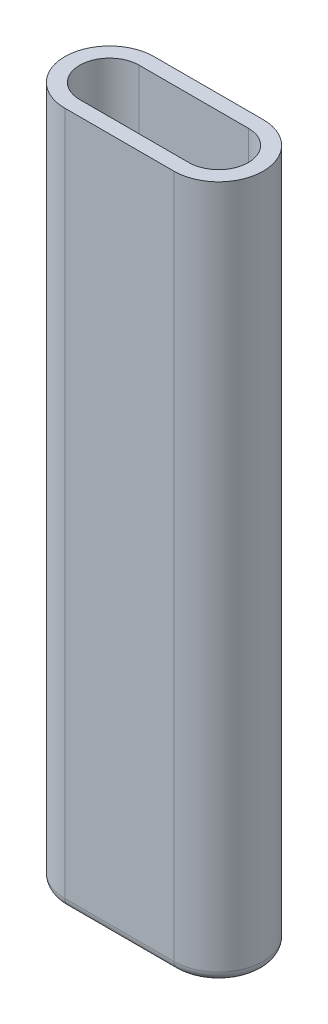
ISO-10303-21;
HEADER;
FILE_DESCRIPTION(('STEP AP214'),'2;1');
FILE_NAME('part.step','',(''),(''),'','','');
FILE_SCHEMA(('AUTOMOTIVE_DESIGN { 1 0 10303 214 1 1 1 1 }'));
ENDSEC;
DATA;
#1=APPLICATION_CONTEXT('core data for automotive mechanical design processes');
#2=APPLICATION_PROTOCOL_DEFINITION('international standard','automotive_design',2000,#1);
#3=PRODUCT_CONTEXT('',#1,'mechanical');
#4=PRODUCT('Part','Part','',(#3));
#5=PRODUCT_RELATED_PRODUCT_CATEGORY('part','',(#4));
#6=PRODUCT_DEFINITION_FORMATION('','',#4);
#7=PRODUCT_DEFINITION_CONTEXT('part definition',#1,'design');
#8=PRODUCT_DEFINITION('design','',#6,#7);
#9=PRODUCT_DEFINITION_SHAPE('','',#8);
#10=(LENGTH_UNIT() NAMED_UNIT(*) SI_UNIT(.MILLI.,.METRE.));
#11=(NAMED_UNIT(*) PLANE_ANGLE_UNIT() SI_UNIT($,.RADIAN.));
#12=(NAMED_UNIT(*) SI_UNIT($,.STERADIAN.) SOLID_ANGLE_UNIT());
#13=UNCERTAINTY_MEASURE_WITH_UNIT(LENGTH_MEASURE(1.E-05),#10,'distance_accuracy_value','');
#14=(GEOMETRIC_REPRESENTATION_CONTEXT(3) GLOBAL_UNCERTAINTY_ASSIGNED_CONTEXT((#13)) GLOBAL_UNIT_ASSIGNED_CONTEXT((#10,
#11,#12)) REPRESENTATION_CONTEXT('',''));
#15=CARTESIAN_POINT('',(0.,0.,0.));
#16=DIRECTION('',(0.,0.,1.));
#17=DIRECTION('',(1.,0.,0.));
#18=AXIS2_PLACEMENT_3D('',#15,#16,#17);
#19=CARTESIAN_POINT('',(-5.5,70.,3.));
#20=DIRECTION('',(0.,0.,-1.));
#21=DIRECTION('',(-1.,0.,0.));
#22=AXIS2_PLACEMENT_3D('',#19,#20,#21);
#23=PLANE('',#22);
#24=DIRECTION('',(1.,0.,0.));
#25=VECTOR('',#24,1.);
#26=CARTESIAN_POINT('',(-5.5,1.5,3.));
#27=LINE('',#26,#25);
#28=CARTESIAN_POINT('',(1.,1.5,3.));
#29=VERTEX_POINT('',#28);
#30=CARTESIAN_POINT('',(5.5,1.5,3.));
#31=VERTEX_POINT('',#30);
#32=EDGE_CURVE('E452',#29,#31,#27,.T.);
#33=ORIENTED_EDGE('',*,*,#32,.F.);
#34=DIRECTION('',(0.,-1.,0.));
#35=VECTOR('',#34,1.);
#36=CARTESIAN_POINT('',(1.,51.5,3.));
#37=LINE('',#36,#35);
#38=CARTESIAN_POINT('',(1.,50.5,3.));
#39=VERTEX_POINT('',#38);
#40=EDGE_CURVE('E153',#39,#29,#37,.T.);
#41=ORIENTED_EDGE('',*,*,#40,.F.);
#42=CARTESIAN_POINT('',(0.,50.5,3.));
#43=DIRECTION('',(0.,0.,-1.));
#44=DIRECTION('',(-1.,0.,0.));
#45=AXIS2_PLACEMENT_3D('',#42,#43,#44);
#46=CIRCLE('',#45,1.);
#47=CARTESIAN_POINT('',(0.,51.5,3.));
#48=VERTEX_POINT('',#47);
#49=EDGE_CURVE('E11',#39,#48,#46,.F.);
#50=ORIENTED_EDGE('',*,*,#49,.T.);
#51=CARTESIAN_POINT('',(0.,50.5,3.));
#52=DIRECTION('',(0.,0.,-1.));
#53=DIRECTION('',(-1.,0.,0.));
#54=AXIS2_PLACEMENT_3D('',#51,#52,#53);
#55=CIRCLE('',#54,1.);
#56=CARTESIAN_POINT('',(-1.,50.5,3.));
#57=VERTEX_POINT('',#56);
#58=EDGE_CURVE('E224',#48,#57,#55,.F.);
#59=ORIENTED_EDGE('',*,*,#58,.T.);
#60=DIRECTION('',(0.,-1.,0.));
#61=VECTOR('',#60,1.);
#62=CARTESIAN_POINT('',(-1.,51.5,3.));
#63=LINE('',#62,#61);
#64=CARTESIAN_POINT('',(-1.,1.5,3.));
#65=VERTEX_POINT('',#64);
#66=EDGE_CURVE('E467',#57,#65,#63,.T.);
#67=ORIENTED_EDGE('',*,*,#66,.T.);
#68=CARTESIAN_POINT('',(-5.5,1.5,3.));
#69=VERTEX_POINT('',#68);
#70=EDGE_CURVE('E446',#69,#65,#27,.T.);
#71=ORIENTED_EDGE('',*,*,#70,.F.);
#72=DIRECTION('',(0.,1.,0.));
#73=VECTOR('',#72,1.);
#74=CARTESIAN_POINT('',(-5.5,70.,3.));
#75=LINE('',#74,#73);
#76=CARTESIAN_POINT('',(-5.5,70.,3.));
#77=VERTEX_POINT('',#76);
#78=EDGE_CURVE('E183',#77,#69,#75,.F.);
#79=ORIENTED_EDGE('',*,*,#78,.F.);
#80=DIRECTION('',(1.,0.,0.));
#81=VECTOR('',#80,1.);
#82=CARTESIAN_POINT('',(-5.5,70.,3.));
#83=LINE('',#82,#81);
#84=CARTESIAN_POINT('',(5.5,70.,3.));
#85=VERTEX_POINT('',#84);
#86=EDGE_CURVE('E166',#77,#85,#83,.T.);
#87=ORIENTED_EDGE('',*,*,#86,.T.);
#88=DIRECTION('',(0.,-1.,0.));
#89=VECTOR('',#88,1.);
#90=CARTESIAN_POINT('',(5.5,70.,3.));
#91=LINE('',#90,#89);
#92=EDGE_CURVE('E457',#85,#31,#91,.T.);
#93=ORIENTED_EDGE('',*,*,#92,.T.);
#94=EDGE_LOOP('',(#33,#41,#50,#59,#67,#71,#79,#87,#93));
#95=FACE_BOUND('',#94,.T.);
#96=ADVANCED_FACE('F33',(#95),#23,.T.);
#97=CARTESIAN_POINT('',(-5.5,70.,-3.));
#98=DIRECTION('',(0.,0.,1.));
#99=DIRECTION('',(1.,0.,0.));
#100=AXIS2_PLACEMENT_3D('',#97,#98,#99);
#101=PLANE('',#100);
#102=CARTESIAN_POINT('',(0.,50.5,-3.));
#103=DIRECTION('',(0.,0.,1.));
#104=DIRECTION('',(1.,0.,0.));
#105=AXIS2_PLACEMENT_3D('',#102,#103,#104);
#106=CIRCLE('',#105,1.);
#107=CARTESIAN_POINT('',(-1.,50.5,-3.));
#108=VERTEX_POINT('',#107);
#109=CARTESIAN_POINT('',(0.,51.5,-3.));
#110=VERTEX_POINT('',#109);
#111=EDGE_CURVE('E50',#108,#110,#106,.F.);
#112=ORIENTED_EDGE('',*,*,#111,.T.);
#113=CARTESIAN_POINT('',(0.,50.5,-3.));
#114=DIRECTION('',(0.,0.,1.));
#115=DIRECTION('',(1.,0.,0.));
#116=AXIS2_PLACEMENT_3D('',#113,#114,#115);
#117=CIRCLE('',#116,1.);
#118=CARTESIAN_POINT('',(1.,50.5,-3.));
#119=VERTEX_POINT('',#118);
#120=EDGE_CURVE('E42',#110,#119,#117,.F.);
#121=ORIENTED_EDGE('',*,*,#120,.T.);
#122=DIRECTION('',(0.,-1.,0.));
#123=VECTOR('',#122,1.);
#124=CARTESIAN_POINT('',(1.,51.5,-3.));
#125=LINE('',#124,#123);
#126=CARTESIAN_POINT('',(1.,1.5,-3.));
#127=VERTEX_POINT('',#126);
#128=EDGE_CURVE('E140',#119,#127,#125,.T.);
#129=ORIENTED_EDGE('',*,*,#128,.T.);
#130=DIRECTION('',(-1.,0.,0.));
#131=VECTOR('',#130,1.);
#132=CARTESIAN_POINT('',(-5.5,1.5,-3.));
#133=LINE('',#132,#131);
#134=CARTESIAN_POINT('',(5.5,1.5,-3.));
#135=VERTEX_POINT('',#134);
#136=EDGE_CURVE('E144',#135,#127,#133,.T.);
#137=ORIENTED_EDGE('',*,*,#136,.F.);
#138=DIRECTION('',(0.,1.,0.));
#139=VECTOR('',#138,1.);
#140=CARTESIAN_POINT('',(5.5,70.,-3.));
#141=LINE('',#140,#139);
#142=CARTESIAN_POINT('',(5.5,70.,-3.));
#143=VERTEX_POINT('',#142);
#144=EDGE_CURVE('E169',#143,#135,#141,.F.);
#145=ORIENTED_EDGE('',*,*,#144,.F.);
#146=DIRECTION('',(-1.,0.,0.));
#147=VECTOR('',#146,1.);
#148=CARTESIAN_POINT('',(-5.5,70.,-3.));
#149=LINE('',#148,#147);
#150=CARTESIAN_POINT('',(-5.5,70.,-3.));
#151=VERTEX_POINT('',#150);
#152=EDGE_CURVE('E176',#143,#151,#149,.T.);
#153=ORIENTED_EDGE('',*,*,#152,.T.);
#154=DIRECTION('',(0.,-1.,0.));
#155=VECTOR('',#154,1.);
#156=CARTESIAN_POINT('',(-5.5,70.,-3.));
#157=LINE('',#156,#155);
#158=CARTESIAN_POINT('',(-5.5,1.5,-3.));
#159=VERTEX_POINT('',#158);
#160=EDGE_CURVE('E178',#151,#159,#157,.T.);
#161=ORIENTED_EDGE('',*,*,#160,.T.);
#162=CARTESIAN_POINT('',(-1.,1.5,-3.));
#163=VERTEX_POINT('',#162);
#164=EDGE_CURVE('E164',#163,#159,#133,.T.);
#165=ORIENTED_EDGE('',*,*,#164,.F.);
#166=DIRECTION('',(0.,-1.,0.));
#167=VECTOR('',#166,1.);
#168=CARTESIAN_POINT('',(-1.,51.5,-3.));
#169=LINE('',#168,#167);
#170=EDGE_CURVE('E148',#108,#163,#169,.T.);
#171=ORIENTED_EDGE('',*,*,#170,.F.);
#172=EDGE_LOOP('',(#112,#121,#129,#137,#145,#153,#161,#165,#171));
#173=FACE_BOUND('',#172,.T.);
#174=ADVANCED_FACE('F142',(#173),#101,.T.);
#175=CARTESIAN_POINT('',(-5.5,1.5,0.));
#176=DIRECTION('',(0.,1.,0.));
#177=DIRECTION('',(0.,0.,1.));
#178=AXIS2_PLACEMENT_3D('',#175,#176,#177);
#179=PLANE('',#178);
#180=ORIENTED_EDGE('',*,*,#136,.T.);
#181=DIRECTION('',(0.,0.,-1.));
#182=VECTOR('',#181,1.);
#183=CARTESIAN_POINT('',(1.,1.5,3.));
#184=LINE('',#183,#182);
#185=EDGE_CURVE('E151',#29,#127,#184,.T.);
#186=ORIENTED_EDGE('',*,*,#185,.F.);
#187=ORIENTED_EDGE('',*,*,#32,.T.);
#188=CARTESIAN_POINT('',(5.5,1.5,0.));
#189=DIRECTION('',(0.,1.,0.));
#190=DIRECTION('',(0.,0.,1.));
#191=AXIS2_PLACEMENT_3D('',#188,#189,#190);
#192=CIRCLE('',#191,3.);
#193=EDGE_CURVE('E161',#31,#135,#192,.T.);
#194=ORIENTED_EDGE('',*,*,#193,.T.);
#195=EDGE_LOOP('',(#180,#186,#187,#194));
#196=FACE_BOUND('',#195,.T.);
#197=ADVANCED_FACE('F159',(#196),#179,.T.);
#198=ORIENTED_EDGE('',*,*,#70,.T.);
#199=DIRECTION('',(0.,0.,1.));
#200=VECTOR('',#199,1.);
#201=CARTESIAN_POINT('',(-1.,1.5,3.));
#202=LINE('',#201,#200);
#203=EDGE_CURVE('E156',#163,#65,#202,.T.);
#204=ORIENTED_EDGE('',*,*,#203,.F.);
#205=ORIENTED_EDGE('',*,*,#164,.T.);
#206=CARTESIAN_POINT('',(-5.5,1.5,0.));
#207=DIRECTION('',(0.,1.,0.));
#208=DIRECTION('',(0.,0.,1.));
#209=AXIS2_PLACEMENT_3D('',#206,#207,#208);
#210=CIRCLE('',#209,3.);
#211=EDGE_CURVE('E147',#159,#69,#210,.T.);
#212=ORIENTED_EDGE('',*,*,#211,.T.);
#213=EDGE_LOOP('',(#198,#204,#205,#212));
#214=FACE_BOUND('',#213,.T.);
#215=ADVANCED_FACE('F281',(#214),#179,.T.);
#216=CARTESIAN_POINT('',(-5.5,70.,0.));
#217=DIRECTION('',(0.,-1.,0.));
#218=DIRECTION('',(0.,0.,-1.));
#219=AXIS2_PLACEMENT_3D('',#216,#217,#218);
#220=CYLINDRICAL_SURFACE('',#219,4.5);
#221=DIRECTION('',(0.,-1.,0.));
#222=VECTOR('',#221,1.);
#223=CARTESIAN_POINT('',(-5.5,70.,-4.5));
#224=LINE('',#223,#222);
#225=CARTESIAN_POINT('',(-5.5,70.,-4.5));
#226=VERTEX_POINT('',#225);
#227=CARTESIAN_POINT('',(-5.5,1.,-4.5));
#228=VERTEX_POINT('',#227);
#229=EDGE_CURVE('E189',#226,#228,#224,.T.);
#230=ORIENTED_EDGE('',*,*,#229,.T.);
#231=CARTESIAN_POINT('',(-5.5,1.,0.));
#232=DIRECTION('',(0.,1.,0.));
#233=DIRECTION('',(0.,0.,1.));
#234=AXIS2_PLACEMENT_3D('',#231,#232,#233);
#235=CIRCLE('',#234,4.5);
#236=CARTESIAN_POINT('',(-5.5,1.,4.5));
#237=VERTEX_POINT('',#236);
#238=EDGE_CURVE('E217',#228,#237,#235,.T.);
#239=ORIENTED_EDGE('',*,*,#238,.T.);
#240=DIRECTION('',(0.,-1.,0.));
#241=VECTOR('',#240,1.);
#242=CARTESIAN_POINT('',(-5.5,70.,4.5));
#243=LINE('',#242,#241);
#244=CARTESIAN_POINT('',(-5.5,70.,4.5));
#245=VERTEX_POINT('',#244);
#246=EDGE_CURVE('E198',#245,#237,#243,.T.);
#247=ORIENTED_EDGE('',*,*,#246,.F.);
#248=CARTESIAN_POINT('',(-5.5,70.,0.));
#249=DIRECTION('',(0.,1.,0.));
#250=DIRECTION('',(0.,0.,1.));
#251=AXIS2_PLACEMENT_3D('',#248,#249,#250);
#252=CIRCLE('',#251,4.5);
#253=EDGE_CURVE('E179',#226,#245,#252,.T.);
#254=ORIENTED_EDGE('',*,*,#253,.F.);
#255=EDGE_LOOP('',(#230,#239,#247,#254));
#256=FACE_BOUND('',#255,.T.);
#257=ADVANCED_FACE('F265',(#256),#220,.T.);
#258=CARTESIAN_POINT('',(-5.5,70.,4.5));
#259=DIRECTION('',(0.,0.,-1.));
#260=DIRECTION('',(-1.,0.,0.));
#261=AXIS2_PLACEMENT_3D('',#258,#259,#260);
#262=PLANE('',#261);
#263=ORIENTED_EDGE('',*,*,#246,.T.);
#264=DIRECTION('',(1.,0.,0.));
#265=VECTOR('',#264,1.);
#266=CARTESIAN_POINT('',(-5.5,1.,4.5));
#267=LINE('',#266,#265);
#268=CARTESIAN_POINT('',(5.5,1.,4.5));
#269=VERTEX_POINT('',#268);
#270=EDGE_CURVE('E215',#237,#269,#267,.T.);
#271=ORIENTED_EDGE('',*,*,#270,.T.);
#272=DIRECTION('',(0.,-1.,0.));
#273=VECTOR('',#272,1.);
#274=CARTESIAN_POINT('',(5.5,70.,4.5));
#275=LINE('',#274,#273);
#276=CARTESIAN_POINT('',(5.5,70.,4.5));
#277=VERTEX_POINT('',#276);
#278=EDGE_CURVE('E195',#277,#269,#275,.T.);
#279=ORIENTED_EDGE('',*,*,#278,.F.);
#280=DIRECTION('',(1.,0.,0.));
#281=VECTOR('',#280,1.);
#282=CARTESIAN_POINT('',(-5.5,70.,4.5));
#283=LINE('',#282,#281);
#284=EDGE_CURVE('E182',#245,#277,#283,.T.);
#285=ORIENTED_EDGE('',*,*,#284,.F.);
#286=EDGE_LOOP('',(#263,#271,#279,#285));
#287=FACE_BOUND('',#286,.T.);
#288=ADVANCED_FACE('F273',(#287),#262,.F.);
#289=CARTESIAN_POINT('',(5.5,70.,0.));
#290=DIRECTION('',(0.,-1.,0.));
#291=DIRECTION('',(0.,0.,-1.));
#292=AXIS2_PLACEMENT_3D('',#289,#290,#291);
#293=CYLINDRICAL_SURFACE('',#292,4.5);
#294=ORIENTED_EDGE('',*,*,#278,.T.);
#295=CARTESIAN_POINT('',(5.5,1.,0.));
#296=DIRECTION('',(0.,1.,0.));
#297=DIRECTION('',(0.,0.,1.));
#298=AXIS2_PLACEMENT_3D('',#295,#296,#297);
#299=CIRCLE('',#298,4.5);
#300=CARTESIAN_POINT('',(5.5,1.,-4.5));
#301=VERTEX_POINT('',#300);
#302=EDGE_CURVE('E213',#269,#301,#299,.T.);
#303=ORIENTED_EDGE('',*,*,#302,.T.);
#304=DIRECTION('',(0.,-1.,0.));
#305=VECTOR('',#304,1.);
#306=CARTESIAN_POINT('',(5.5,70.,-4.5));
#307=LINE('',#306,#305);
#308=CARTESIAN_POINT('',(5.5,70.,-4.5));
#309=VERTEX_POINT('',#308);
#310=EDGE_CURVE('E192',#309,#301,#307,.T.);
#311=ORIENTED_EDGE('',*,*,#310,.F.);
#312=CARTESIAN_POINT('',(5.5,70.,0.));
#313=DIRECTION('',(0.,1.,0.));
#314=DIRECTION('',(0.,0.,1.));
#315=AXIS2_PLACEMENT_3D('',#312,#313,#314);
#316=CIRCLE('',#315,4.5);
#317=EDGE_CURVE('E185',#277,#309,#316,.T.);
#318=ORIENTED_EDGE('',*,*,#317,.F.);
#319=EDGE_LOOP('',(#294,#303,#311,#318));
#320=FACE_BOUND('',#319,.T.);
#321=ADVANCED_FACE('F271',(#320),#293,.T.);
#322=CARTESIAN_POINT('',(-5.5,70.,-4.5));
#323=DIRECTION('',(0.,0.,1.));
#324=DIRECTION('',(1.,0.,0.));
#325=AXIS2_PLACEMENT_3D('',#322,#323,#324);
#326=PLANE('',#325);
#327=ORIENTED_EDGE('',*,*,#310,.T.);
#328=DIRECTION('',(-1.,0.,0.));
#329=VECTOR('',#328,1.);
#330=CARTESIAN_POINT('',(-5.5,1.,-4.5));
#331=LINE('',#330,#329);
#332=EDGE_CURVE('E201',#301,#228,#331,.T.);
#333=ORIENTED_EDGE('',*,*,#332,.T.);
#334=ORIENTED_EDGE('',*,*,#229,.F.);
#335=DIRECTION('',(-1.,0.,0.));
#336=VECTOR('',#335,1.);
#337=CARTESIAN_POINT('',(-5.5,70.,-4.5));
#338=LINE('',#337,#336);
#339=EDGE_CURVE('E187',#309,#226,#338,.T.);
#340=ORIENTED_EDGE('',*,*,#339,.F.);
#341=EDGE_LOOP('',(#327,#333,#334,#340));
#342=FACE_BOUND('',#341,.T.);
#343=ADVANCED_FACE('F261',(#342),#326,.F.);
#344=CARTESIAN_POINT('',(-5.5,70.,0.));
#345=DIRECTION('',(0.,1.,0.));
#346=DIRECTION('',(0.,0.,1.));
#347=AXIS2_PLACEMENT_3D('',#344,#345,#346);
#348=PLANE('',#347);
#349=CARTESIAN_POINT('',(-5.5,70.,0.));
#350=DIRECTION('',(0.,1.,0.));
#351=DIRECTION('',(0.,0.,1.));
#352=AXIS2_PLACEMENT_3D('',#349,#350,#351);
#353=CIRCLE('',#352,3.);
#354=EDGE_CURVE('E163',#151,#77,#353,.T.);
#355=ORIENTED_EDGE('',*,*,#354,.F.);
#356=ORIENTED_EDGE('',*,*,#152,.F.);
#357=CARTESIAN_POINT('',(5.5,70.,0.));
#358=DIRECTION('',(0.,1.,0.));
#359=DIRECTION('',(0.,0.,1.));
#360=AXIS2_PLACEMENT_3D('',#357,#358,#359);
#361=CIRCLE('',#360,3.);
#362=EDGE_CURVE('E173',#85,#143,#361,.T.);
#363=ORIENTED_EDGE('',*,*,#362,.F.);
#364=ORIENTED_EDGE('',*,*,#86,.F.);
#365=EDGE_LOOP('',(#355,#356,#363,#364));
#366=FACE_BOUND('',#365,.T.);
#367=ORIENTED_EDGE('',*,*,#253,.T.);
#368=ORIENTED_EDGE('',*,*,#284,.T.);
#369=ORIENTED_EDGE('',*,*,#317,.T.);
#370=ORIENTED_EDGE('',*,*,#339,.T.);
#371=EDGE_LOOP('',(#367,#368,#369,#370));
#372=FACE_BOUND('',#371,.T.);
#373=ADVANCED_FACE('F267',(#366,#372),#348,.T.);
#374=CARTESIAN_POINT('',(-5.5,0.,0.));
#375=DIRECTION('',(0.,1.,0.));
#376=DIRECTION('',(0.,0.,1.));
#377=AXIS2_PLACEMENT_3D('',#374,#375,#376);
#378=PLANE('',#377);
#379=CARTESIAN_POINT('',(-5.5,0.,0.));
#380=DIRECTION('',(0.,1.,0.));
#381=DIRECTION('',(0.,0.,1.));
#382=AXIS2_PLACEMENT_3D('',#379,#380,#381);
#383=CIRCLE('',#382,3.5);
#384=CARTESIAN_POINT('',(-5.5,0.,3.5));
#385=VERTEX_POINT('',#384);
#386=CARTESIAN_POINT('',(-5.5,0.,-3.5));
#387=VERTEX_POINT('',#386);
#388=EDGE_CURVE('E204',#385,#387,#383,.F.);
#389=ORIENTED_EDGE('',*,*,#388,.T.);
#390=DIRECTION('',(-1.,0.,0.));
#391=VECTOR('',#390,1.);
#392=CARTESIAN_POINT('',(-5.5,0.,-3.5));
#393=LINE('',#392,#391);
#394=CARTESIAN_POINT('',(5.5,0.,-3.5));
#395=VERTEX_POINT('',#394);
#396=EDGE_CURVE('E210',#387,#395,#393,.F.);
#397=ORIENTED_EDGE('',*,*,#396,.T.);
#398=CARTESIAN_POINT('',(5.5,0.,0.));
#399=DIRECTION('',(0.,1.,0.));
#400=DIRECTION('',(0.,0.,1.));
#401=AXIS2_PLACEMENT_3D('',#398,#399,#400);
#402=CIRCLE('',#401,3.5);
#403=CARTESIAN_POINT('',(5.5,0.,3.5));
#404=VERTEX_POINT('',#403);
#405=EDGE_CURVE('E208',#395,#404,#402,.F.);
#406=ORIENTED_EDGE('',*,*,#405,.T.);
#407=DIRECTION('',(1.,0.,0.));
#408=VECTOR('',#407,1.);
#409=CARTESIAN_POINT('',(-5.5,0.,3.5));
#410=LINE('',#409,#408);
#411=EDGE_CURVE('E206',#404,#385,#410,.F.);
#412=ORIENTED_EDGE('',*,*,#411,.T.);
#413=EDGE_LOOP('',(#389,#397,#406,#412));
#414=FACE_BOUND('',#413,.T.);
#415=ADVANCED_FACE('F248',(#414),#378,.F.);
#416=CARTESIAN_POINT('',(-5.5,70.,0.));
#417=DIRECTION('',(0.,-1.,0.));
#418=DIRECTION('',(0.,0.,-1.));
#419=AXIS2_PLACEMENT_3D('',#416,#417,#418);
#420=CYLINDRICAL_SURFACE('',#419,3.);
#421=ORIENTED_EDGE('',*,*,#211,.F.);
#422=ORIENTED_EDGE('',*,*,#160,.F.);
#423=ORIENTED_EDGE('',*,*,#354,.T.);
#424=ORIENTED_EDGE('',*,*,#78,.T.);
#425=EDGE_LOOP('',(#421,#422,#423,#424));
#426=FACE_BOUND('',#425,.T.);
#427=ADVANCED_FACE('F291',(#426),#420,.F.);
#428=CARTESIAN_POINT('',(5.5,70.,0.));
#429=DIRECTION('',(0.,-1.,0.));
#430=DIRECTION('',(0.,0.,-1.));
#431=AXIS2_PLACEMENT_3D('',#428,#429,#430);
#432=CYLINDRICAL_SURFACE('',#431,3.);
#433=ORIENTED_EDGE('',*,*,#193,.F.);
#434=ORIENTED_EDGE('',*,*,#92,.F.);
#435=ORIENTED_EDGE('',*,*,#362,.T.);
#436=ORIENTED_EDGE('',*,*,#144,.T.);
#437=EDGE_LOOP('',(#433,#434,#435,#436));
#438=FACE_BOUND('',#437,.T.);
#439=ADVANCED_FACE('F293',(#438),#432,.F.);
#440=CARTESIAN_POINT('',(1.,51.5,3.));
#441=DIRECTION('',(-1.,0.,0.));
#442=DIRECTION('',(0.,0.,1.));
#443=AXIS2_PLACEMENT_3D('',#440,#441,#442);
#444=PLANE('',#443);
#445=ORIENTED_EDGE('',*,*,#128,.F.);
#446=DIRECTION('',(0.,0.,-1.));
#447=VECTOR('',#446,1.);
#448=CARTESIAN_POINT('',(1.,50.5,3.));
#449=LINE('',#448,#447);
#450=EDGE_CURVE('E222',#119,#39,#449,.F.);
#451=ORIENTED_EDGE('',*,*,#450,.T.);
#452=ORIENTED_EDGE('',*,*,#40,.T.);
#453=ORIENTED_EDGE('',*,*,#185,.T.);
#454=EDGE_LOOP('',(#445,#451,#452,#453));
#455=FACE_BOUND('',#454,.T.);
#456=ADVANCED_FACE('F152',(#455),#444,.F.);
#457=CARTESIAN_POINT('',(-1.,51.5,3.));
#458=DIRECTION('',(1.,0.,0.));
#459=DIRECTION('',(0.,0.,-1.));
#460=AXIS2_PLACEMENT_3D('',#457,#458,#459);
#461=PLANE('',#460);
#462=ORIENTED_EDGE('',*,*,#66,.F.);
#463=DIRECTION('',(0.,0.,1.));
#464=VECTOR('',#463,1.);
#465=CARTESIAN_POINT('',(-1.,50.5,3.));
#466=LINE('',#465,#464);
#467=EDGE_CURVE('E219',#57,#108,#466,.F.);
#468=ORIENTED_EDGE('',*,*,#467,.T.);
#469=ORIENTED_EDGE('',*,*,#170,.T.);
#470=ORIENTED_EDGE('',*,*,#203,.T.);
#471=EDGE_LOOP('',(#462,#468,#469,#470));
#472=FACE_BOUND('',#471,.T.);
#473=ADVANCED_FACE('F334',(#472),#461,.F.);
#474=CARTESIAN_POINT('',(-5.5,1.,3.5));
#475=DIRECTION('',(1.,0.,0.));
#476=DIRECTION('',(0.,0.,-1.));
#477=AXIS2_PLACEMENT_3D('',#474,#475,#476);
#478=CYLINDRICAL_SURFACE('',#477,1.);
#479=CARTESIAN_POINT('',(-5.5,1.,3.5));
#480=DIRECTION('',(-1.,0.,0.));
#481=DIRECTION('',(0.,0.,1.));
#482=AXIS2_PLACEMENT_3D('',#479,#480,#481);
#483=CIRCLE('',#482,1.);
#484=EDGE_CURVE('E232',#385,#237,#483,.T.);
#485=ORIENTED_EDGE('',*,*,#484,.F.);
#486=ORIENTED_EDGE('',*,*,#411,.F.);
#487=CARTESIAN_POINT('',(5.5,1.,3.5));
#488=DIRECTION('',(1.,0.,0.));
#489=DIRECTION('',(0.,0.,-1.));
#490=AXIS2_PLACEMENT_3D('',#487,#488,#489);
#491=CIRCLE('',#490,1.);
#492=EDGE_CURVE('E157',#269,#404,#491,.T.);
#493=ORIENTED_EDGE('',*,*,#492,.F.);
#494=ORIENTED_EDGE('',*,*,#270,.F.);
#495=EDGE_LOOP('',(#485,#486,#493,#494));
#496=FACE_BOUND('',#495,.T.);
#497=ADVANCED_FACE('F245',(#496),#478,.T.);
#498=CARTESIAN_POINT('',(5.5,1.,0.));
#499=DIRECTION('',(0.,1.,0.));
#500=DIRECTION('',(0.,0.,1.));
#501=AXIS2_PLACEMENT_3D('',#498,#499,#500);
#502=TOROIDAL_SURFACE('',#501,3.5,1.);
#503=ORIENTED_EDGE('',*,*,#492,.T.);
#504=ORIENTED_EDGE('',*,*,#405,.F.);
#505=CARTESIAN_POINT('',(5.5,1.,-3.5));
#506=DIRECTION('',(-1.,0.,0.));
#507=DIRECTION('',(0.,0.,1.));
#508=AXIS2_PLACEMENT_3D('',#505,#506,#507);
#509=CIRCLE('',#508,1.);
#510=EDGE_CURVE('E230',#301,#395,#509,.T.);
#511=ORIENTED_EDGE('',*,*,#510,.F.);
#512=ORIENTED_EDGE('',*,*,#302,.F.);
#513=EDGE_LOOP('',(#503,#504,#511,#512));
#514=FACE_BOUND('',#513,.T.);
#515=ADVANCED_FACE('F239',(#514),#502,.T.);
#516=CARTESIAN_POINT('',(-5.5,1.,0.));
#517=DIRECTION('',(0.,1.,0.));
#518=DIRECTION('',(0.,0.,1.));
#519=AXIS2_PLACEMENT_3D('',#516,#517,#518);
#520=TOROIDAL_SURFACE('',#519,3.5,1.);
#521=ORIENTED_EDGE('',*,*,#484,.T.);
#522=ORIENTED_EDGE('',*,*,#238,.F.);
#523=CARTESIAN_POINT('',(-5.5,1.,-3.5));
#524=DIRECTION('',(1.,0.,0.));
#525=DIRECTION('',(0.,0.,-1.));
#526=AXIS2_PLACEMENT_3D('',#523,#524,#525);
#527=CIRCLE('',#526,1.);
#528=EDGE_CURVE('E228',#387,#228,#527,.T.);
#529=ORIENTED_EDGE('',*,*,#528,.F.);
#530=ORIENTED_EDGE('',*,*,#388,.F.);
#531=EDGE_LOOP('',(#521,#522,#529,#530));
#532=FACE_BOUND('',#531,.T.);
#533=ADVANCED_FACE('F256',(#532),#520,.T.);
#534=CARTESIAN_POINT('',(-5.5,1.,-3.5));
#535=DIRECTION('',(-1.,0.,0.));
#536=DIRECTION('',(0.,0.,1.));
#537=AXIS2_PLACEMENT_3D('',#534,#535,#536);
#538=CYLINDRICAL_SURFACE('',#537,1.);
#539=ORIENTED_EDGE('',*,*,#510,.T.);
#540=ORIENTED_EDGE('',*,*,#396,.F.);
#541=ORIENTED_EDGE('',*,*,#528,.T.);
#542=ORIENTED_EDGE('',*,*,#332,.F.);
#543=EDGE_LOOP('',(#539,#540,#541,#542));
#544=FACE_BOUND('',#543,.T.);
#545=ADVANCED_FACE('F252',(#544),#538,.T.);
#546=CARTESIAN_POINT('',(0.,50.5,0.));
#547=DIRECTION('',(0.,0.,-1.));
#548=DIRECTION('',(-1.,0.,0.));
#549=AXIS2_PLACEMENT_3D('',#546,#547,#548);
#550=CYLINDRICAL_SURFACE('',#549,1.);
#551=ORIENTED_EDGE('',*,*,#450,.F.);
#552=ORIENTED_EDGE('',*,*,#120,.F.);
#553=DIRECTION('',(0.,0.,-1.));
#554=VECTOR('',#553,1.);
#555=CARTESIAN_POINT('',(0.,51.5,0.));
#556=LINE('',#555,#554);
#557=EDGE_CURVE('E37',#48,#110,#556,.T.);
#558=ORIENTED_EDGE('',*,*,#557,.F.);
#559=ORIENTED_EDGE('',*,*,#49,.F.);
#560=EDGE_LOOP('',(#551,#552,#558,#559));
#561=FACE_BOUND('',#560,.T.);
#562=ADVANCED_FACE('F35',(#561),#550,.T.);
#563=CARTESIAN_POINT('',(0.,50.5,0.));
#564=DIRECTION('',(0.,0.,1.));
#565=DIRECTION('',(1.,0.,0.));
#566=AXIS2_PLACEMENT_3D('',#563,#564,#565);
#567=CYLINDRICAL_SURFACE('',#566,1.);
#568=ORIENTED_EDGE('',*,*,#111,.F.);
#569=ORIENTED_EDGE('',*,*,#467,.F.);
#570=ORIENTED_EDGE('',*,*,#58,.F.);
#571=ORIENTED_EDGE('',*,*,#557,.T.);
#572=EDGE_LOOP('',(#568,#569,#570,#571));
#573=FACE_BOUND('',#572,.T.);
#574=ADVANCED_FACE('F371',(#573),#567,.T.);
#575=CLOSED_SHELL('',(#96,#174,#197,#215,#257,#288,#321,#343,#373,#415,#427,#439,#456,#473,#497,
#515,#533,#545,#562,#574));
#576=MANIFOLD_SOLID_BREP('B2',#575);
#577=ADVANCED_BREP_SHAPE_REPRESENTATION('',(#18,#576),#14);
#578=SHAPE_DEFINITION_REPRESENTATION(#9,#577);
ENDSEC;
END-ISO-10303-21;
